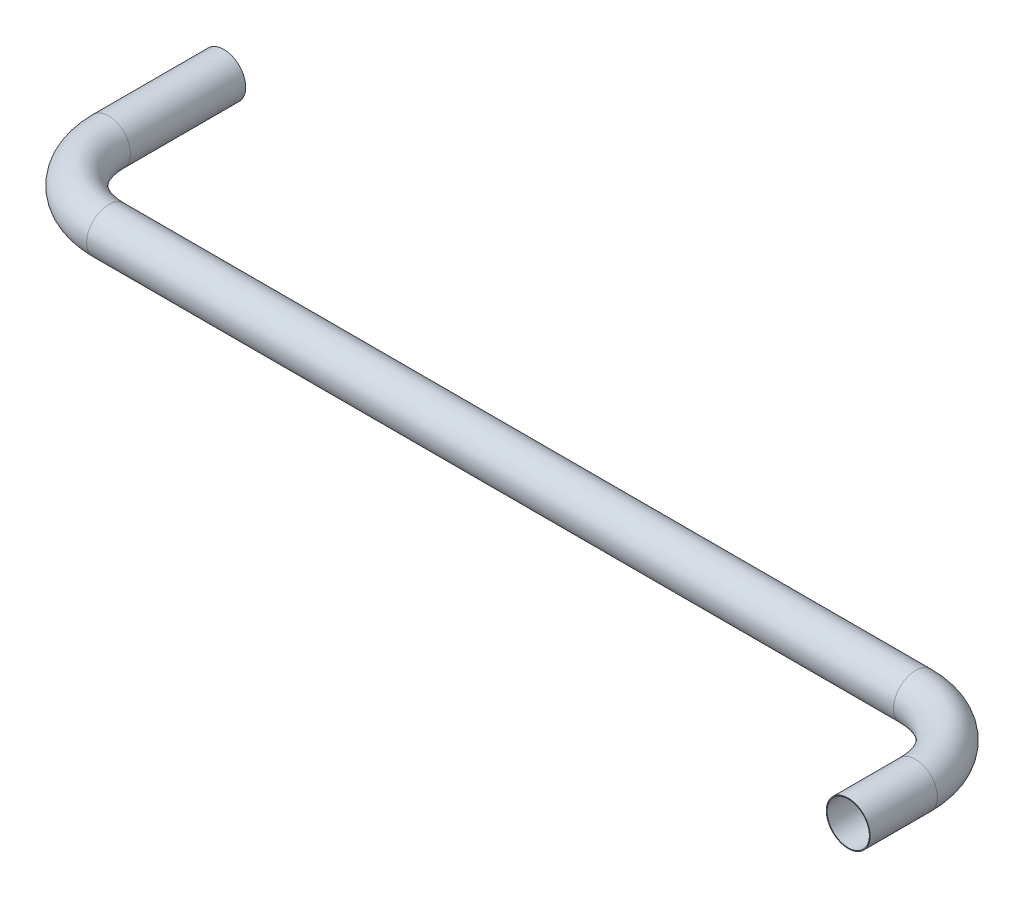
ISO-10303-21;
HEADER;
FILE_DESCRIPTION(('STEP AP214'),'2;1');
FILE_NAME('part.step','',(''),(''),'','','');
FILE_SCHEMA(('AUTOMOTIVE_DESIGN { 1 0 10303 214 1 1 1 1 }'));
ENDSEC;
DATA;
#1=APPLICATION_CONTEXT('core data for automotive mechanical design processes');
#2=APPLICATION_PROTOCOL_DEFINITION('international standard','automotive_design',2000,#1);
#3=PRODUCT_CONTEXT('',#1,'mechanical');
#4=PRODUCT('Part','Part','',(#3));
#5=PRODUCT_RELATED_PRODUCT_CATEGORY('part','',(#4));
#6=PRODUCT_DEFINITION_FORMATION('','',#4);
#7=PRODUCT_DEFINITION_CONTEXT('part definition',#1,'design');
#8=PRODUCT_DEFINITION('design','',#6,#7);
#9=PRODUCT_DEFINITION_SHAPE('','',#8);
#10=(LENGTH_UNIT() NAMED_UNIT(*) SI_UNIT(.MILLI.,.METRE.));
#11=(NAMED_UNIT(*) PLANE_ANGLE_UNIT() SI_UNIT($,.RADIAN.));
#12=(NAMED_UNIT(*) SI_UNIT($,.STERADIAN.) SOLID_ANGLE_UNIT());
#13=UNCERTAINTY_MEASURE_WITH_UNIT(LENGTH_MEASURE(1.E-05),#10,'distance_accuracy_value','');
#14=(GEOMETRIC_REPRESENTATION_CONTEXT(3) GLOBAL_UNCERTAINTY_ASSIGNED_CONTEXT((#13)) GLOBAL_UNIT_ASSIGNED_CONTEXT((#10,
#11,#12)) REPRESENTATION_CONTEXT('',''));
#15=CARTESIAN_POINT('',(0.,0.,0.));
#16=DIRECTION('',(0.,0.,1.));
#17=DIRECTION('',(1.,0.,0.));
#18=AXIS2_PLACEMENT_3D('',#15,#16,#17);
#19=CARTESIAN_POINT('',(0.,0.,0.));
#20=DIRECTION('',(0.,0.,-1.));
#21=DIRECTION('',(-1.,0.,0.));
#22=AXIS2_PLACEMENT_3D('',#19,#20,#21);
#23=CYLINDRICAL_SURFACE('',#22,45.59);
#24=CARTESIAN_POINT('',(0.,0.,-139.999999999999));
#25=DIRECTION('',(0.,0.,1.));
#26=DIRECTION('',(1.,0.,0.));
#27=AXIS2_PLACEMENT_3D('',#24,#25,#26);
#28=CIRCLE('',#27,45.59);
#29=CARTESIAN_POINT('',(45.59,0.,-139.999999999999));
#30=VERTEX_POINT('',#29);
#31=EDGE_CURVE('E124',#30,#30,#28,.T.);
#32=ORIENTED_EDGE('',*,*,#31,.T.);
#33=EDGE_LOOP('',(#32));
#34=FACE_BOUND('',#33,.T.);
#35=CARTESIAN_POINT('',(0.,0.,0.));
#36=DIRECTION('',(0.,0.,1.));
#37=DIRECTION('',(1.,0.,0.));
#38=AXIS2_PLACEMENT_3D('',#35,#36,#37);
#39=CIRCLE('',#38,45.59);
#40=CARTESIAN_POINT('',(45.59,0.,0.));
#41=VERTEX_POINT('',#40);
#42=EDGE_CURVE('E58',#41,#41,#39,.T.);
#43=ORIENTED_EDGE('',*,*,#42,.F.);
#44=EDGE_LOOP('',(#43));
#45=FACE_BOUND('',#44,.T.);
#46=ADVANCED_FACE('F43',(#34,#45),#23,.T.);
#47=CARTESIAN_POINT('',(-160.,0.,-140.));
#48=DIRECTION('',(0.,1.,0.));
#49=DIRECTION('',(0.,0.,1.));
#50=AXIS2_PLACEMENT_3D('',#47,#48,#49);
#51=TOROIDAL_SURFACE('',#50,160.,45.59);
#52=CARTESIAN_POINT('',(-160.000000000001,0.,-300.));
#53=DIRECTION('',(1.,0.,0.));
#54=DIRECTION('',(0.,0.,-1.));
#55=AXIS2_PLACEMENT_3D('',#52,#53,#54);
#56=CIRCLE('',#55,45.59);
#57=CARTESIAN_POINT('',(-160.000000000001,0.,-345.59));
#58=VERTEX_POINT('',#57);
#59=EDGE_CURVE('E127',#58,#58,#56,.T.);
#60=CARTESIAN_POINT('',(-160.,0.,-140.));
#61=DIRECTION('',(0.,1.,0.));
#62=DIRECTION('',(0.,0.,1.));
#63=AXIS2_PLACEMENT_3D('',#60,#61,#62);
#64=CIRCLE('',#63,205.59);
#65=EDGE_CURVE('',#30,#58,#64,.T.);
#66=ORIENTED_EDGE('',*,*,#31,.F.);
#67=ORIENTED_EDGE('',*,*,#59,.T.);
#68=ORIENTED_EDGE('',*,*,#65,.T.);
#69=ORIENTED_EDGE('',*,*,#65,.F.);
#70=EDGE_LOOP('',(#66,#68,#67,#69));
#71=FACE_BOUND('',#70,.T.);
#72=ADVANCED_FACE('F148',(#71),#51,.T.);
#73=CARTESIAN_POINT('',(-160.000000000001,0.,-300.));
#74=DIRECTION('',(-1.,0.,0.));
#75=DIRECTION('',(0.,0.,1.));
#76=AXIS2_PLACEMENT_3D('',#73,#74,#75);
#77=CYLINDRICAL_SURFACE('',#76,45.59);
#78=CARTESIAN_POINT('',(-1840.,0.,-300.));
#79=DIRECTION('',(1.,0.,0.));
#80=DIRECTION('',(0.,0.,-1.));
#81=AXIS2_PLACEMENT_3D('',#78,#79,#80);
#82=CIRCLE('',#81,45.59);
#83=CARTESIAN_POINT('',(-1840.,0.,-254.41));
#84=VERTEX_POINT('',#83);
#85=EDGE_CURVE('E129',#84,#84,#82,.T.);
#86=ORIENTED_EDGE('',*,*,#85,.T.);
#87=EDGE_LOOP('',(#86));
#88=FACE_BOUND('',#87,.T.);
#89=ORIENTED_EDGE('',*,*,#59,.F.);
#90=EDGE_LOOP('',(#89));
#91=FACE_BOUND('',#90,.T.);
#92=ADVANCED_FACE('F144',(#88,#91),#77,.T.);
#93=CARTESIAN_POINT('',(-1840.,0.,-460.));
#94=DIRECTION('',(0.,-1.,0.));
#95=DIRECTION('',(0.,0.,-1.));
#96=AXIS2_PLACEMENT_3D('',#93,#94,#95);
#97=TOROIDAL_SURFACE('',#96,160.,45.59);
#98=CARTESIAN_POINT('',(-2000.,0.,-460.000000000001));
#99=DIRECTION('',(0.,0.,1.));
#100=DIRECTION('',(1.,0.,0.));
#101=AXIS2_PLACEMENT_3D('',#98,#99,#100);
#102=CIRCLE('',#101,45.59);
#103=CARTESIAN_POINT('',(-2045.59,0.,-460.000000000001));
#104=VERTEX_POINT('',#103);
#105=EDGE_CURVE('E47',#104,#104,#102,.T.);
#106=CARTESIAN_POINT('',(-1840.,0.,-460.));
#107=DIRECTION('',(0.,-1.,0.));
#108=DIRECTION('',(0.,0.,-1.));
#109=AXIS2_PLACEMENT_3D('',#106,#107,#108);
#110=CIRCLE('',#109,205.59);
#111=EDGE_CURVE('',#84,#104,#110,.T.);
#112=ORIENTED_EDGE('',*,*,#85,.F.);
#113=ORIENTED_EDGE('',*,*,#105,.T.);
#114=ORIENTED_EDGE('',*,*,#111,.T.);
#115=ORIENTED_EDGE('',*,*,#111,.F.);
#116=EDGE_LOOP('',(#112,#114,#113,#115));
#117=FACE_BOUND('',#116,.T.);
#118=ADVANCED_FACE('F136',(#117),#97,.T.);
#119=CARTESIAN_POINT('',(-2000.,0.,-460.000000000001));
#120=DIRECTION('',(0.,0.,-1.));
#121=DIRECTION('',(-1.,0.,0.));
#122=AXIS2_PLACEMENT_3D('',#119,#120,#121);
#123=CYLINDRICAL_SURFACE('',#122,45.59);
#124=CARTESIAN_POINT('',(-2000.,0.,-700.));
#125=DIRECTION('',(0.,0.,1.));
#126=DIRECTION('',(1.,0.,0.));
#127=AXIS2_PLACEMENT_3D('',#124,#125,#126);
#128=CIRCLE('',#127,45.59);
#129=CARTESIAN_POINT('',(-1954.41,0.,-700.));
#130=VERTEX_POINT('',#129);
#131=EDGE_CURVE('E63',#130,#130,#128,.T.);
#132=ORIENTED_EDGE('',*,*,#131,.T.);
#133=EDGE_LOOP('',(#132));
#134=FACE_BOUND('',#133,.T.);
#135=ORIENTED_EDGE('',*,*,#105,.F.);
#136=EDGE_LOOP('',(#135));
#137=FACE_BOUND('',#136,.T.);
#138=ADVANCED_FACE('F45',(#134,#137),#123,.T.);
#139=CARTESIAN_POINT('',(0.,0.,0.));
#140=DIRECTION('',(0.,0.,1.));
#141=DIRECTION('',(1.,0.,0.));
#142=AXIS2_PLACEMENT_3D('',#139,#140,#141);
#143=PLANE('',#142);
#144=CARTESIAN_POINT('',(0.,0.,0.));
#145=DIRECTION('',(0.,0.,1.));
#146=DIRECTION('',(1.,0.,0.));
#147=AXIS2_PLACEMENT_3D('',#144,#145,#146);
#148=CIRCLE('',#147,44.09);
#149=CARTESIAN_POINT('',(44.09,0.,0.));
#150=VERTEX_POINT('',#149);
#151=EDGE_CURVE('E111',#150,#150,#148,.F.);
#152=ORIENTED_EDGE('',*,*,#151,.T.);
#153=EDGE_LOOP('',(#152));
#154=FACE_BOUND('',#153,.T.);
#155=ORIENTED_EDGE('',*,*,#42,.T.);
#156=EDGE_LOOP('',(#155));
#157=FACE_BOUND('',#156,.T.);
#158=ADVANCED_FACE('F76',(#154,#157),#143,.T.);
#159=CARTESIAN_POINT('',(-2000.,0.,-700.));
#160=DIRECTION('',(0.,0.,1.));
#161=DIRECTION('',(1.,0.,0.));
#162=AXIS2_PLACEMENT_3D('',#159,#160,#161);
#163=PLANE('',#162);
#164=CARTESIAN_POINT('',(-2000.,0.,-700.));
#165=DIRECTION('',(0.,0.,1.));
#166=DIRECTION('',(1.,0.,0.));
#167=AXIS2_PLACEMENT_3D('',#164,#165,#166);
#168=CIRCLE('',#167,44.09);
#169=CARTESIAN_POINT('',(-1955.91,0.,-700.));
#170=VERTEX_POINT('',#169);
#171=EDGE_CURVE('E13',#170,#170,#168,.F.);
#172=ORIENTED_EDGE('',*,*,#171,.F.);
#173=EDGE_LOOP('',(#172));
#174=FACE_BOUND('',#173,.T.);
#175=ORIENTED_EDGE('',*,*,#131,.F.);
#176=EDGE_LOOP('',(#175));
#177=FACE_BOUND('',#176,.T.);
#178=ADVANCED_FACE('F73',(#174,#177),#163,.F.);
#179=CARTESIAN_POINT('',(0.,0.,0.));
#180=DIRECTION('',(0.,0.,-1.));
#181=DIRECTION('',(-1.,0.,0.));
#182=AXIS2_PLACEMENT_3D('',#179,#180,#181);
#183=CYLINDRICAL_SURFACE('',#182,44.09);
#184=CARTESIAN_POINT('',(0.,0.,-139.999999999999));
#185=DIRECTION('',(0.,0.,1.));
#186=DIRECTION('',(1.,0.,0.));
#187=AXIS2_PLACEMENT_3D('',#184,#185,#186);
#188=CIRCLE('',#187,44.09);
#189=CARTESIAN_POINT('',(44.09,0.,-139.999999999999));
#190=VERTEX_POINT('',#189);
#191=EDGE_CURVE('E110',#190,#190,#188,.F.);
#192=ORIENTED_EDGE('',*,*,#191,.T.);
#193=EDGE_LOOP('',(#192));
#194=FACE_BOUND('',#193,.T.);
#195=ORIENTED_EDGE('',*,*,#151,.F.);
#196=EDGE_LOOP('',(#195));
#197=FACE_BOUND('',#196,.T.);
#198=ADVANCED_FACE('F75',(#194,#197),#183,.F.);
#199=CARTESIAN_POINT('',(-160.,0.,-140.));
#200=DIRECTION('',(0.,1.,0.));
#201=DIRECTION('',(0.,0.,1.));
#202=AXIS2_PLACEMENT_3D('',#199,#200,#201);
#203=TOROIDAL_SURFACE('',#202,160.,44.09);
#204=CARTESIAN_POINT('',(-160.000000000001,0.,-300.));
#205=DIRECTION('',(1.,0.,0.));
#206=DIRECTION('',(0.,0.,-1.));
#207=AXIS2_PLACEMENT_3D('',#204,#205,#206);
#208=CIRCLE('',#207,44.09);
#209=CARTESIAN_POINT('',(-160.000000000001,0.,-344.09));
#210=VERTEX_POINT('',#209);
#211=EDGE_CURVE('E107',#210,#210,#208,.F.);
#212=CARTESIAN_POINT('',(-160.,0.,-140.));
#213=DIRECTION('',(0.,1.,0.));
#214=DIRECTION('',(0.,0.,1.));
#215=AXIS2_PLACEMENT_3D('',#212,#213,#214);
#216=CIRCLE('',#215,204.09);
#217=EDGE_CURVE('',#190,#210,#216,.T.);
#218=ORIENTED_EDGE('',*,*,#191,.F.);
#219=ORIENTED_EDGE('',*,*,#211,.T.);
#220=ORIENTED_EDGE('',*,*,#217,.T.);
#221=ORIENTED_EDGE('',*,*,#217,.F.);
#222=EDGE_LOOP('',(#218,#220,#219,#221));
#223=FACE_BOUND('',#222,.T.);
#224=ADVANCED_FACE('F82',(#223),#203,.F.);
#225=CARTESIAN_POINT('',(-160.000000000001,0.,-300.));
#226=DIRECTION('',(-1.,0.,0.));
#227=DIRECTION('',(0.,0.,1.));
#228=AXIS2_PLACEMENT_3D('',#225,#226,#227);
#229=CYLINDRICAL_SURFACE('',#228,44.09);
#230=CARTESIAN_POINT('',(-1840.,0.,-300.));
#231=DIRECTION('',(1.,0.,0.));
#232=DIRECTION('',(0.,0.,-1.));
#233=AXIS2_PLACEMENT_3D('',#230,#231,#232);
#234=CIRCLE('',#233,44.09);
#235=CARTESIAN_POINT('',(-1840.,0.,-255.91));
#236=VERTEX_POINT('',#235);
#237=EDGE_CURVE('E113',#236,#236,#234,.F.);
#238=ORIENTED_EDGE('',*,*,#237,.T.);
#239=EDGE_LOOP('',(#238));
#240=FACE_BOUND('',#239,.T.);
#241=ORIENTED_EDGE('',*,*,#211,.F.);
#242=EDGE_LOOP('',(#241));
#243=FACE_BOUND('',#242,.T.);
#244=ADVANCED_FACE('F93',(#240,#243),#229,.F.);
#245=CARTESIAN_POINT('',(-1840.,0.,-460.));
#246=DIRECTION('',(0.,-1.,0.));
#247=DIRECTION('',(0.,0.,-1.));
#248=AXIS2_PLACEMENT_3D('',#245,#246,#247);
#249=TOROIDAL_SURFACE('',#248,160.,44.09);
#250=CARTESIAN_POINT('',(-2000.,0.,-460.000000000001));
#251=DIRECTION('',(0.,0.,1.));
#252=DIRECTION('',(1.,0.,0.));
#253=AXIS2_PLACEMENT_3D('',#250,#251,#252);
#254=CIRCLE('',#253,44.09);
#255=CARTESIAN_POINT('',(-2044.09,0.,-460.000000000001));
#256=VERTEX_POINT('',#255);
#257=EDGE_CURVE('E52',#256,#256,#254,.F.);
#258=CARTESIAN_POINT('',(-1840.,0.,-460.));
#259=DIRECTION('',(0.,-1.,0.));
#260=DIRECTION('',(0.,0.,-1.));
#261=AXIS2_PLACEMENT_3D('',#258,#259,#260);
#262=CIRCLE('',#261,204.09);
#263=EDGE_CURVE('',#236,#256,#262,.T.);
#264=ORIENTED_EDGE('',*,*,#237,.F.);
#265=ORIENTED_EDGE('',*,*,#257,.T.);
#266=ORIENTED_EDGE('',*,*,#263,.T.);
#267=ORIENTED_EDGE('',*,*,#263,.F.);
#268=EDGE_LOOP('',(#264,#266,#265,#267));
#269=FACE_BOUND('',#268,.T.);
#270=ADVANCED_FACE('F89',(#269),#249,.F.);
#271=CARTESIAN_POINT('',(-2000.,0.,-460.000000000001));
#272=DIRECTION('',(0.,0.,-1.));
#273=DIRECTION('',(-1.,0.,0.));
#274=AXIS2_PLACEMENT_3D('',#271,#272,#273);
#275=CYLINDRICAL_SURFACE('',#274,44.09);
#276=ORIENTED_EDGE('',*,*,#171,.T.);
#277=EDGE_LOOP('',(#276));
#278=FACE_BOUND('',#277,.T.);
#279=ORIENTED_EDGE('',*,*,#257,.F.);
#280=EDGE_LOOP('',(#279));
#281=FACE_BOUND('',#280,.T.);
#282=ADVANCED_FACE('F70',(#278,#281),#275,.F.);
#283=CLOSED_SHELL('',(#46,#72,#92,#118,#138,#158,#178,#198,#224,#244,#270,#282));
#284=MANIFOLD_SOLID_BREP('B2',#283);
#285=ADVANCED_BREP_SHAPE_REPRESENTATION('',(#18,#284),#14);
#286=SHAPE_DEFINITION_REPRESENTATION(#9,#285);
ENDSEC;
END-ISO-10303-21;
